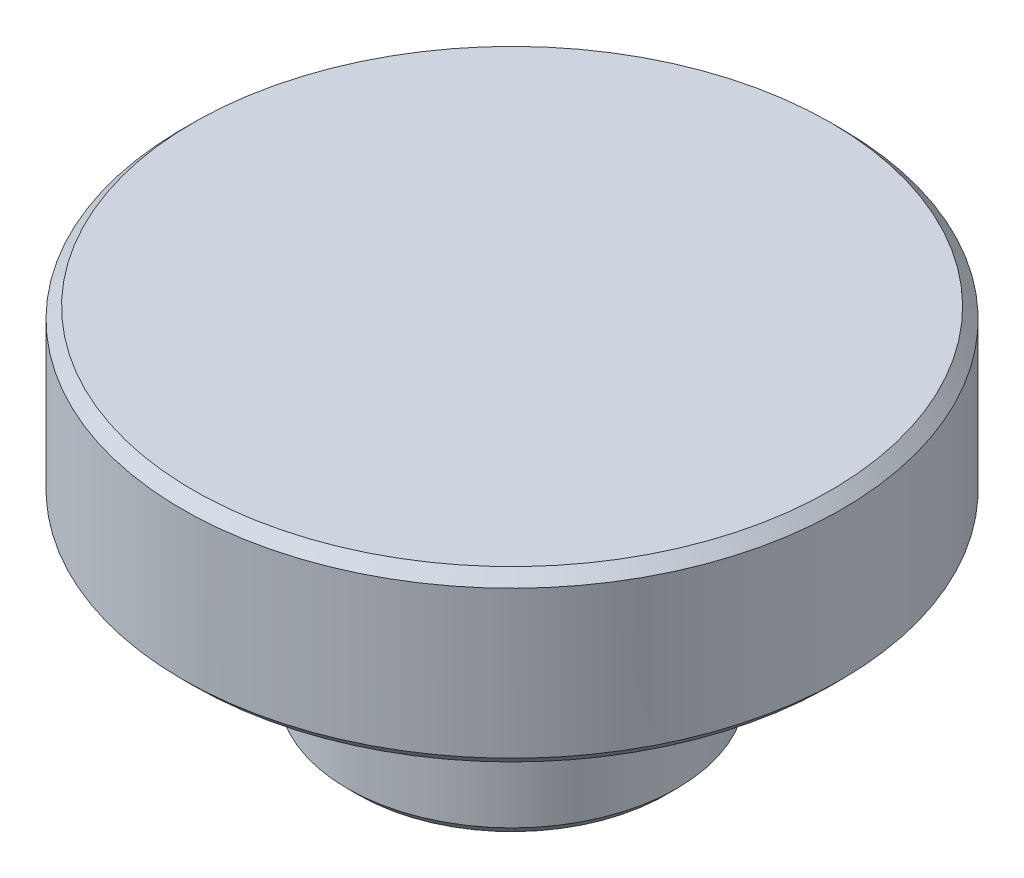
ISO-10303-21;
HEADER;
FILE_DESCRIPTION(('STEP AP214'),'2;1');
FILE_NAME('part.step','',(''),(''),'','','');
FILE_SCHEMA(('AUTOMOTIVE_DESIGN { 1 0 10303 214 1 1 1 1 }'));
ENDSEC;
DATA;
#1=APPLICATION_CONTEXT('core data for automotive mechanical design processes');
#2=APPLICATION_PROTOCOL_DEFINITION('international standard','automotive_design',2000,#1);
#3=PRODUCT_CONTEXT('',#1,'mechanical');
#4=PRODUCT('Part','Part','',(#3));
#5=PRODUCT_RELATED_PRODUCT_CATEGORY('part','',(#4));
#6=PRODUCT_DEFINITION_FORMATION('','',#4);
#7=PRODUCT_DEFINITION_CONTEXT('part definition',#1,'design');
#8=PRODUCT_DEFINITION('design','',#6,#7);
#9=PRODUCT_DEFINITION_SHAPE('','',#8);
#10=(LENGTH_UNIT() NAMED_UNIT(*) SI_UNIT(.MILLI.,.METRE.));
#11=(NAMED_UNIT(*) PLANE_ANGLE_UNIT() SI_UNIT($,.RADIAN.));
#12=(NAMED_UNIT(*) SI_UNIT($,.STERADIAN.) SOLID_ANGLE_UNIT());
#13=UNCERTAINTY_MEASURE_WITH_UNIT(LENGTH_MEASURE(1.E-05),#10,'distance_accuracy_value','');
#14=(GEOMETRIC_REPRESENTATION_CONTEXT(3) GLOBAL_UNCERTAINTY_ASSIGNED_CONTEXT((#13)) GLOBAL_UNIT_ASSIGNED_CONTEXT((#10,
#11,#12)) REPRESENTATION_CONTEXT('',''));
#15=CARTESIAN_POINT('',(0.,0.,0.));
#16=DIRECTION('',(0.,0.,1.));
#17=DIRECTION('',(1.,0.,0.));
#18=AXIS2_PLACEMENT_3D('',#15,#16,#17);
#19=CARTESIAN_POINT('',(0.,15.75,0.));
#20=DIRECTION('',(0.,-1.,0.));
#21=DIRECTION('',(0.,0.,-1.));
#22=AXIS2_PLACEMENT_3D('',#19,#20,#21);
#23=PLANE('',#22);
#24=CARTESIAN_POINT('',(0.,15.75,0.));
#25=DIRECTION('',(0.,-1.,0.));
#26=DIRECTION('',(0.,0.,-1.));
#27=AXIS2_PLACEMENT_3D('',#24,#25,#26);
#28=CIRCLE('',#27,14.5);
#29=CARTESIAN_POINT('',(0.,15.75,-14.5));
#30=VERTEX_POINT('',#29);
#31=EDGE_CURVE('E12',#30,#30,#28,.F.);
#32=ORIENTED_EDGE('',*,*,#31,.T.);
#33=EDGE_LOOP('',(#32));
#34=FACE_BOUND('',#33,.T.);
#35=ADVANCED_FACE('F42',(#34),#23,.F.);
#36=CARTESIAN_POINT('',(0.,0.,0.));
#37=DIRECTION('',(0.,-1.,0.));
#38=DIRECTION('',(0.,0.,-1.));
#39=AXIS2_PLACEMENT_3D('',#36,#37,#38);
#40=CYLINDRICAL_SURFACE('',#39,15.);
#41=CARTESIAN_POINT('',(0.,8.54999999999999,0.));
#42=DIRECTION('',(0.,1.,0.));
#43=DIRECTION('',(0.,0.,1.));
#44=AXIS2_PLACEMENT_3D('',#41,#42,#43);
#45=CIRCLE('',#44,15.);
#46=CARTESIAN_POINT('',(0.,8.54999999999999,15.));
#47=VERTEX_POINT('',#46);
#48=EDGE_CURVE('E54',#47,#47,#45,.T.);
#49=ORIENTED_EDGE('',*,*,#48,.T.);
#50=EDGE_LOOP('',(#49));
#51=FACE_BOUND('',#50,.T.);
#52=CARTESIAN_POINT('',(0.,15.25,0.));
#53=DIRECTION('',(0.,-1.,0.));
#54=DIRECTION('',(0.,0.,-1.));
#55=AXIS2_PLACEMENT_3D('',#52,#53,#54);
#56=CIRCLE('',#55,15.);
#57=CARTESIAN_POINT('',(0.,15.25,-15.));
#58=VERTEX_POINT('',#57);
#59=EDGE_CURVE('E58',#58,#58,#56,.T.);
#60=ORIENTED_EDGE('',*,*,#59,.T.);
#61=EDGE_LOOP('',(#60));
#62=FACE_BOUND('',#61,.T.);
#63=ADVANCED_FACE('F119',(#51,#62),#40,.T.);
#64=CARTESIAN_POINT('',(-15.,8.05,0.));
#65=DIRECTION('',(0.,1.,0.));
#66=DIRECTION('',(0.,0.,1.));
#67=AXIS2_PLACEMENT_3D('',#64,#65,#66);
#68=PLANE('',#67);
#69=CARTESIAN_POINT('',(0.,8.05,0.));
#70=DIRECTION('',(0.,1.,0.));
#71=DIRECTION('',(0.,0.,1.));
#72=AXIS2_PLACEMENT_3D('',#69,#70,#71);
#73=CIRCLE('',#72,7.99999999999999);
#74=CARTESIAN_POINT('',(0.,8.05,7.99999999999999));
#75=VERTEX_POINT('',#74);
#76=EDGE_CURVE('E63',#75,#75,#73,.T.);
#77=ORIENTED_EDGE('',*,*,#76,.T.);
#78=EDGE_LOOP('',(#77));
#79=FACE_BOUND('',#78,.T.);
#80=CARTESIAN_POINT('',(0.,8.05,0.));
#81=DIRECTION('',(0.,1.,0.));
#82=DIRECTION('',(0.,0.,1.));
#83=AXIS2_PLACEMENT_3D('',#80,#81,#82);
#84=CIRCLE('',#83,14.5);
#85=CARTESIAN_POINT('',(0.,8.05,14.5));
#86=VERTEX_POINT('',#85);
#87=EDGE_CURVE('E66',#86,#86,#84,.F.);
#88=ORIENTED_EDGE('',*,*,#87,.T.);
#89=EDGE_LOOP('',(#88));
#90=FACE_BOUND('',#89,.T.);
#91=ADVANCED_FACE('F115',(#79,#90),#68,.F.);
#92=CARTESIAN_POINT('',(0.,0.,0.));
#93=DIRECTION('',(0.,-1.,0.));
#94=DIRECTION('',(0.,0.,-1.));
#95=AXIS2_PLACEMENT_3D('',#92,#93,#94);
#96=CYLINDRICAL_SURFACE('',#95,7.5);
#97=CARTESIAN_POINT('',(0.,5.5,-7.5));
#98=CARTESIAN_POINT('',(-0.0559044178346422,5.49999764514654,-7.49999917871272));
#99=CARTESIAN_POINT('',(-0.11184298963814,5.49529623101876,-7.49936835363597));
#100=CARTESIAN_POINT('',(-0.22216136256904,5.47661682547522,-7.49691255563452));
#101=CARTESIAN_POINT('',(-0.276539511166519,5.46262935255143,-7.49508636220862));
#102=CARTESIAN_POINT('',(-0.382124156313492,5.42579914122928,-7.49044539924533));
#103=CARTESIAN_POINT('',(-0.433332841529247,5.40296259448078,-7.48763132105486));
#104=CARTESIAN_POINT('',(-0.53118194751515,5.34909654309686,-7.48132693330196));
#105=CARTESIAN_POINT('',(-0.577823103168513,5.31806835941677,-7.47783673279283));
#106=CARTESIAN_POINT('',(-0.665512911252339,5.24849336919791,-7.47054497394982));
#107=CARTESIAN_POINT('',(-0.706528992747932,5.20990567749577,-7.46674179081055));
#108=CARTESIAN_POINT('',(-0.781523678365509,5.12639490546167,-7.45926568778975));
#109=CARTESIAN_POINT('',(-0.815501909986106,5.0814714900021,-7.45559277481171));
#110=CARTESIAN_POINT('',(-0.875579511344538,4.98635043852748,-7.44877717720095));
#111=CARTESIAN_POINT('',(-0.90164803741289,4.93613315876069,-7.44563658882881));
#112=CARTESIAN_POINT('',(-0.944969225036452,4.83198446638161,-7.44026293689616));
#113=CARTESIAN_POINT('',(-0.96222226622639,4.77805321382334,-7.43802983425604));
#114=CARTESIAN_POINT('',(-0.98732303386087,4.66834709474917,-7.43473968284334));
#115=CARTESIAN_POINT('',(-0.995226021142533,4.61258508273354,-7.43367572685068));
#116=CARTESIAN_POINT('',(-1.00157340274059,4.50051691019702,-7.43282325804657));
#117=CARTESIAN_POINT('',(-1.00001822816801,4.44421077459455,-7.433034687102));
#118=CARTESIAN_POINT('',(-0.987538729696173,4.33303943498603,-7.43470277886495));
#119=CARTESIAN_POINT('',(-0.976675487658809,4.27816723505715,-7.43615132311171));
#120=CARTESIAN_POINT('',(-0.945983623171858,4.17103158161996,-7.44011776387373));
#121=CARTESIAN_POINT('',(-0.926154796307287,4.11876818762249,-7.44263568477064));
#122=CARTESIAN_POINT('',(-0.878029645715956,4.0181451826464,-7.44846630555513));
#123=CARTESIAN_POINT('',(-0.849706989568747,3.96979831440285,-7.45178147061949));
#124=CARTESIAN_POINT('',(-0.785416966721447,3.87852045904117,-7.45883118109967));
#125=CARTESIAN_POINT('',(-0.749449202511926,3.83558975372292,-7.46256574831765));
#126=CARTESIAN_POINT('',(-0.670552450131813,3.75600849370905,-7.47006949616793));
#127=CARTESIAN_POINT('',(-0.627570853513224,3.71941007864884,-7.47383871770599));
#128=CARTESIAN_POINT('',(-0.536047085066705,3.6539389775358,-7.48095961909132));
#129=CARTESIAN_POINT('',(-0.487504897221186,3.62506631373824,-7.48431129773577));
#130=CARTESIAN_POINT('',(-0.386196109865235,3.57586544115263,-7.4902219687179));
#131=CARTESIAN_POINT('',(-0.333427789420616,3.55554073447684,-7.49278063604478));
#132=CARTESIAN_POINT('',(-0.225185462168125,3.52405534051383,-7.49681412952036));
#133=CARTESIAN_POINT('',(-0.169711599771129,3.5128941646803,-7.49828901344964));
#134=CARTESIAN_POINT('',(-0.0580834516628217,3.50012078361444,-7.49998120688428));
#135=CARTESIAN_POINT('',(-0.00193751727352099,3.49843679910826,-7.50020796924523));
#136=CARTESIAN_POINT('',(0.109835808609359,3.50447583206359,-7.49940395769259));
#137=CARTESIAN_POINT('',(0.165463212672832,3.51219862089118,-7.49837321434299));
#138=CARTESIAN_POINT('',(0.274406857786469,3.53677232669199,-7.4951758767905));
#139=CARTESIAN_POINT('',(0.327731008256023,3.55358878416107,-7.49301357151461));
#140=CARTESIAN_POINT('',(0.43080254939678,3.59583648296854,-7.48779504627144));
#141=CARTESIAN_POINT('',(0.480549803507819,3.62126805300662,-7.4847387921972));
#142=CARTESIAN_POINT('',(0.57537443930804,3.68019607779165,-7.47804918685037));
#143=CARTESIAN_POINT('',(0.620422907198302,3.71373868285667,-7.47441257522858));
#144=CARTESIAN_POINT('',(0.704276473495949,3.78787166461213,-7.46697864354991));
#145=CARTESIAN_POINT('',(0.743081288311893,3.82846236125822,-7.4631813162031));
#146=CARTESIAN_POINT('',(0.813602747115491,3.91585657131977,-7.45582451236755));
#147=CARTESIAN_POINT('',(0.845271638044692,3.96269878336908,-7.45226674387649));
#148=CARTESIAN_POINT('',(0.90029175539407,4.06107970514046,-7.44582066500908));
#149=CARTESIAN_POINT('',(0.923643167551733,4.11261830995519,-7.44293233968392));
#150=CARTESIAN_POINT('',(0.961289182503731,4.21877862101385,-7.43816405890039));
#151=CARTESIAN_POINT('',(0.975610144233978,4.2733908426054,-7.43628117116299));
#152=CARTESIAN_POINT('',(0.994873335719795,4.38427181606438,-7.43372874349146));
#153=CARTESIAN_POINT('',(0.999816067133909,4.44054047916222,-7.43305913865671));
#154=CARTESIAN_POINT('',(1.00017242903095,4.55266174542675,-7.43301115647724));
#155=CARTESIAN_POINT('',(0.995661095972464,4.60851412048212,-7.4336226114126));
#156=CARTESIAN_POINT('',(0.977396883433446,4.71865893755194,-7.43604591937099));
#157=CARTESIAN_POINT('',(0.963644007416343,4.77295138015099,-7.43785777194415));
#158=CARTESIAN_POINT('',(0.927311551661037,4.87842184162579,-7.44247445136382));
#159=CARTESIAN_POINT('',(0.904736104095206,4.92960130555843,-7.445278813297));
#160=CARTESIAN_POINT('',(0.851406713798687,5.02745794191303,-7.45156522856411));
#161=CARTESIAN_POINT('',(0.820652613152143,5.07413502737802,-7.45504729498301));
#162=CARTESIAN_POINT('',(0.751562242547542,5.1620448249642,-7.46232983591531));
#163=CARTESIAN_POINT('',(0.713170136134505,5.20323347387756,-7.46613252877041));
#164=CARTESIAN_POINT('',(0.630010846749118,5.27861160818077,-7.47360859500832));
#165=CARTESIAN_POINT('',(0.585242170364888,5.31279944937512,-7.47728193784489));
#166=CARTESIAN_POINT('',(0.490376493926411,5.37333356923326,-7.48410317568764));
#167=CARTESIAN_POINT('',(0.440257310371983,5.39964533327762,-7.48724873213445));
#168=CARTESIAN_POINT('',(0.336296204793664,5.44344029927254,-7.49263660329486));
#169=CARTESIAN_POINT('',(0.282458339484944,5.46093295431243,-7.49487988462156));
#170=CARTESIAN_POINT('',(0.190294204049209,5.48247400319259,-7.49767860871633));
#171=CARTESIAN_POINT('',(0.152545540977889,5.48903662176182,-7.49854481817537));
#172=CARTESIAN_POINT('',(0.0765365858080555,5.49780040708274,-7.49970579245385));
#173=CARTESIAN_POINT('',(0.03827629822562,5.5000016123068,-7.500000562314));
#174=CARTESIAN_POINT('',(0.,5.5,-7.5));
#175=B_SPLINE_CURVE_WITH_KNOTS('',3,(#97,#98,#99,#100,#101,#102,#103,#104,#105,#106,#107,#108,
#109,#110,#111,#112,#113,#114,#115,#116,#117,#118,#119,#120,#121,#122,#123,#124,#125,#126,#127,
#128,#129,#130,#131,#132,#133,#134,#135,#136,#137,#138,#139,#140,#141,#142,#143,#144,#145,#146,
#147,#148,#149,#150,#151,#152,#153,#154,#155,#156,#157,#158,#159,#160,#161,#162,#163,#164,#165,
#166,#167,#168,#169,#170,#171,#172,#173,#174),.UNSPECIFIED.,.T.,.F.,(4,2,2,2,2,2,2,2,2,2,2,2,2,
2,2,2,2,2,2,2,2,2,2,2,2,2,2,2,2,2,2,2,2,2,2,2,2,2,4),(0.,0.167573425652872,0.335318215442522,
0.502945846413703,0.670546462820173,0.839079892217795,1.00762223952418,1.17681360755824,
1.34599768883102,1.5141767795718,1.6823482046246,1.84942442549022,2.01650445587925,
2.18410791568949,2.35172009221899,2.52065272242425,2.68958583926148,2.85858810101269,
3.02758135195872,3.19529292496031,3.36300042177239,3.53007681698232,3.69715958751773,
3.86521637384942,4.03328079129381,4.20243852267725,4.37159247636524,4.54025037367727,
4.70889924891818,4.87621463748313,5.04352996334373,5.21076701851311,5.37800730297952,
5.54651833917554,5.71506890625581,5.88434763337258,6.0534445249621,6.16817869523655,
6.2829118534272),.UNSPECIFIED.);
#176=CARTESIAN_POINT('',(0.,5.5,-7.5));
#177=VERTEX_POINT('',#176);
#178=EDGE_CURVE('E84',#177,#177,#175,.T.);
#179=ORIENTED_EDGE('',*,*,#178,.T.);
#180=EDGE_LOOP('',(#179));
#181=FACE_BOUND('',#180,.T.);
#182=CARTESIAN_POINT('',(0.,0.500000000000007,0.));
#183=DIRECTION('',(0.,1.,0.));
#184=DIRECTION('',(0.,0.,1.));
#185=AXIS2_PLACEMENT_3D('',#182,#183,#184);
#186=CIRCLE('',#185,7.5);
#187=CARTESIAN_POINT('',(0.,0.500000000000007,7.5));
#188=VERTEX_POINT('',#187);
#189=EDGE_CURVE('E69',#188,#188,#186,.T.);
#190=ORIENTED_EDGE('',*,*,#189,.T.);
#191=EDGE_LOOP('',(#190));
#192=FACE_BOUND('',#191,.T.);
#193=CARTESIAN_POINT('',(0.,7.55000000000001,0.));
#194=DIRECTION('',(0.,1.,0.));
#195=DIRECTION('',(0.,0.,1.));
#196=AXIS2_PLACEMENT_3D('',#193,#194,#195);
#197=CIRCLE('',#196,7.5);
#198=CARTESIAN_POINT('',(0.,7.55000000000001,7.5));
#199=VERTEX_POINT('',#198);
#200=EDGE_CURVE('E72',#199,#199,#197,.F.);
#201=ORIENTED_EDGE('',*,*,#200,.T.);
#202=EDGE_LOOP('',(#201));
#203=FACE_BOUND('',#202,.T.);
#204=ADVANCED_FACE('F89',(#181,#192,#203),#96,.T.);
#205=CARTESIAN_POINT('',(-7.5,0.,0.));
#206=DIRECTION('',(0.,1.,0.));
#207=DIRECTION('',(0.,0.,1.));
#208=AXIS2_PLACEMENT_3D('',#205,#206,#207);
#209=PLANE('',#208);
#210=CARTESIAN_POINT('',(0.,0.,0.));
#211=DIRECTION('',(0.,1.,0.));
#212=DIRECTION('',(0.,0.,1.));
#213=AXIS2_PLACEMENT_3D('',#210,#211,#212);
#214=CIRCLE('',#213,7.);
#215=CARTESIAN_POINT('',(0.,0.,7.));
#216=VERTEX_POINT('',#215);
#217=EDGE_CURVE('E75',#216,#216,#214,.F.);
#218=ORIENTED_EDGE('',*,*,#217,.T.);
#219=EDGE_LOOP('',(#218));
#220=FACE_BOUND('',#219,.T.);
#221=CARTESIAN_POINT('',(0.,0.,0.));
#222=DIRECTION('',(0.,-1.,0.));
#223=DIRECTION('',(0.,0.,-1.));
#224=AXIS2_PLACEMENT_3D('',#221,#222,#223);
#225=CIRCLE('',#224,2.5);
#226=CARTESIAN_POINT('',(0.,0.,-2.5));
#227=VERTEX_POINT('',#226);
#228=EDGE_CURVE('E78',#227,#227,#225,.T.);
#229=ORIENTED_EDGE('',*,*,#228,.F.);
#230=EDGE_LOOP('',(#229));
#231=FACE_BOUND('',#230,.T.);
#232=ADVANCED_FACE('F106',(#220,#231),#209,.F.);
#233=CARTESIAN_POINT('',(0.,0.,0.));
#234=DIRECTION('',(0.,-1.,0.));
#235=DIRECTION('',(0.,0.,-1.));
#236=AXIS2_PLACEMENT_3D('',#233,#234,#235);
#237=CYLINDRICAL_SURFACE('',#236,2.5);
#238=CARTESIAN_POINT('',(0.,5.5,-2.5));
#239=CARTESIAN_POINT('',(0.0537465027214457,5.49999507408814,-2.49999635613542));
#240=CARTESIAN_POINT('',(0.107586282045337,5.49564112395581,-2.49824647153466));
#241=CARTESIAN_POINT('',(0.213748240208948,5.47837614823938,-2.49141726550321));
#242=CARTESIAN_POINT('',(0.266065888780624,5.46544186045693,-2.48632889349439));
#243=CARTESIAN_POINT('',(0.367476961363702,5.43156196097059,-2.47337104606559));
#244=CARTESIAN_POINT('',(0.416580330808479,5.41064257689164,-2.46551068182036));
#245=CARTESIAN_POINT('',(0.510535985164184,5.36149041333673,-2.44778305398039));
#246=CARTESIAN_POINT('',(0.555389738375496,5.33326017254053,-2.43791648729028));
#247=CARTESIAN_POINT('',(0.641750503785197,5.26888225071953,-2.41665443085209));
#248=CARTESIAN_POINT('',(0.683031136275107,5.23244667187987,-2.40521148464595));
#249=CARTESIAN_POINT('',(0.759087502392361,5.15329999826161,-2.38230288453097));
#250=CARTESIAN_POINT('',(0.793860053566767,5.11058585139413,-2.37083722226896));
#251=CARTESIAN_POINT('',(0.85743728364644,5.01778596487887,-2.34861395898568));
#252=CARTESIAN_POINT('',(0.885907490597737,4.9674567569884,-2.33791057982476));
#253=CARTESIAN_POINT('',(0.933877359518575,4.86223180078998,-2.31916823593396));
#254=CARTESIAN_POINT('',(0.953381282142918,4.80733823607582,-2.31112800622088));
#255=CARTESIAN_POINT('',(0.981949411697934,4.69714383320395,-2.29913178830409));
#256=CARTESIAN_POINT('',(0.991446982902824,4.64197438221189,-2.29500710177802));
#257=CARTESIAN_POINT('',(1.00108648082002,4.53068250084637,-2.29082002024572));
#258=CARTESIAN_POINT('',(1.00123300815661,4.47456055268749,-2.29075562761384));
#259=CARTESIAN_POINT('',(0.992494683752273,4.36712166427098,-2.29455250139997));
#260=CARTESIAN_POINT('',(0.984237657152569,4.31574214279548,-2.29814087519225));
#261=CARTESIAN_POINT('',(0.959973440148911,4.21517022199664,-2.30838093803918));
#262=CARTESIAN_POINT('',(0.943964897402316,4.16597820594485,-2.31503316160836));
#263=CARTESIAN_POINT('',(0.904347366275537,4.06999108190198,-2.33079742544265));
#264=CARTESIAN_POINT('',(0.880589931157659,4.02326538047265,-2.33995689640394));
#265=CARTESIAN_POINT('',(0.826253230366107,3.93429209181922,-2.35969058194945));
#266=CARTESIAN_POINT('',(0.795671402550422,3.8920461952986,-2.37026532728424));
#267=CARTESIAN_POINT('',(0.725775299727218,3.809795135599,-2.39263368371135));
#268=CARTESIAN_POINT('',(0.685968731485318,3.77021563527699,-2.40445832488076));
#269=CARTESIAN_POINT('',(0.600157213715097,3.69815776099898,-2.42729912479141));
#270=CARTESIAN_POINT('',(0.554151032667217,3.66568080129485,-2.43831512222662));
#271=CARTESIAN_POINT('',(0.456038826302922,3.60819127629208,-2.45857340632274));
#272=CARTESIAN_POINT('',(0.403830245673239,3.58333885940147,-2.46777635047707));
#273=CARTESIAN_POINT('',(0.295511882741441,3.54291606946097,-2.48307414164379));
#274=CARTESIAN_POINT('',(0.239404098424837,3.52734098122129,-2.48917056731191));
#275=CARTESIAN_POINT('',(0.12844794380391,3.50677585229015,-2.49728069753455));
#276=CARTESIAN_POINT('',(0.0737216469927676,3.50121377287322,-2.49951472916757));
#277=CARTESIAN_POINT('',(-0.0359226549039085,3.49914344973569,-2.50034239255315));
#278=CARTESIAN_POINT('',(-0.0908406066119618,3.50263285922624,-2.49893696791146));
#279=CARTESIAN_POINT('',(-0.196716369560994,3.51814587627599,-2.49278783531877));
#280=CARTESIAN_POINT('',(-0.247741245887737,3.52977899017549,-2.48819695672762));
#281=CARTESIAN_POINT('',(-0.34706771403039,3.56071785415491,-2.4762972070275));
#282=CARTESIAN_POINT('',(-0.395368955112422,3.58002458983434,-2.46898798678265));
#283=CARTESIAN_POINT('',(-0.489539392908351,3.62639246983997,-2.45208297385406));
#284=CARTESIAN_POINT('',(-0.535289011377703,3.65367273602157,-2.44242407989902));
#285=CARTESIAN_POINT('',(-0.621721795623278,3.71497016195282,-2.42186682372762));
#286=CARTESIAN_POINT('',(-0.662402920380563,3.74899002146131,-2.41096796555135));
#287=CARTESIAN_POINT('',(-0.74036152151441,3.82543500647481,-2.38822558819056));
#288=CARTESIAN_POINT('',(-0.777236966903033,3.8682667707531,-2.37636720712526));
#289=CARTESIAN_POINT('',(-0.843375598706856,3.95972004150468,-2.35370836458566));
#290=CARTESIAN_POINT('',(-0.872637530668755,4.00834250016997,-2.34290807763255));
#291=CARTESIAN_POINT('',(-0.922903750965814,4.11073084729705,-2.32357149953854));
#292=CARTESIAN_POINT('',(-0.943825297267228,4.16454199960616,-2.31505815442394));
#293=CARTESIAN_POINT('',(-0.976148109852653,4.27536682585758,-2.30161836738966));
#294=CARTESIAN_POINT('',(-0.987556402634659,4.33237810290621,-2.29668927847999));
#295=CARTESIAN_POINT('',(-0.999857808639202,4.44356395088727,-2.29135879649963));
#296=CARTESIAN_POINT('',(-1.00144854115143,4.49764741979668,-2.29065710504086));
#297=CARTESIAN_POINT('',(-0.995901579638763,4.60527242885665,-2.29307418016549));
#298=CARTESIAN_POINT('',(-0.988764993956892,4.65881403695129,-2.29619246162397));
#299=CARTESIAN_POINT('',(-0.966535683076825,4.76166609492752,-2.3056332453951));
#300=CARTESIAN_POINT('',(-0.95176874678549,4.8110601372165,-2.31182415913725));
#301=CARTESIAN_POINT('',(-0.915002724245507,4.90668931480674,-2.32662000616348));
#302=CARTESIAN_POINT('',(-0.893001640696907,4.95292357344991,-2.33522560603003));
#303=CARTESIAN_POINT('',(-0.840936381379866,5.04380480963539,-2.35449304802246));
#304=CARTESIAN_POINT('',(-0.810482667579745,5.08820933506524,-2.36524441156621));
#305=CARTESIAN_POINT('',(-0.742946059635748,5.17149665860188,-2.38731902186119));
#306=CARTESIAN_POINT('',(-0.705861167409061,5.21037778606416,-2.39864244024203));
#307=CARTESIAN_POINT('',(-0.623252753136232,5.28410142663181,-2.42146783543697));
#308=CARTESIAN_POINT('',(-0.577338000573069,5.31851865344903,-2.43293378981093));
#309=CARTESIAN_POINT('',(-0.47995016014289,5.37916852131082,-2.45400203356858));
#310=CARTESIAN_POINT('',(-0.428474502273619,5.40539735607627,-2.46360345546453));
#311=CARTESIAN_POINT('',(-0.322369031247602,5.44831110759515,-2.47969857407931));
#312=CARTESIAN_POINT('',(-0.267815809109848,5.46516466178017,-2.48624681527514));
#313=CARTESIAN_POINT('',(-0.156438273140611,5.48931956047713,-2.49572153104683));
#314=CARTESIAN_POINT('',(-0.0996217629294565,5.49665121837195,-2.49865949747819));
#315=CARTESIAN_POINT('',(-0.0284561489454649,5.49969769048914,-2.49987949752068));
#316=CARTESIAN_POINT('',(-0.0142313443703792,5.5000013043146,-2.50000096484588));
#317=CARTESIAN_POINT('',(0.,5.5,-2.5));
#318=B_SPLINE_CURVE_WITH_KNOTS('',3,(#238,#239,#240,#241,#242,#243,#244,#245,#246,#247,#248,
#249,#250,#251,#252,#253,#254,#255,#256,#257,#258,#259,#260,#261,#262,#263,#264,#265,#266,#267,
#268,#269,#270,#271,#272,#273,#274,#275,#276,#277,#278,#279,#280,#281,#282,#283,#284,#285,#286,
#287,#288,#289,#290,#291,#292,#293,#294,#295,#296,#297,#298,#299,#300,#301,#302,#303,#304,#305,
#306,#307,#308,#309,#310,#311,#312,#313,#314,#315,#316,#317),.UNSPECIFIED.,.T.,.F.,(4,2,2,2,2,2,
2,2,2,2,2,2,2,2,2,2,2,2,2,2,2,2,2,2,2,2,2,2,2,2,2,2,2,2,2,2,2,2,2,4),(0.,0.161201493946536,
0.322841818003967,0.48395572873579,0.645013767839921,0.812986908501986,0.981041974672057,
1.15657629409608,1.33202711559134,1.49952052654414,1.66693153170244,1.82269164200686,
1.97847893628024,2.13744563149408,2.29647210969092,2.46779174593279,2.63914546419867,
2.81388456581403,2.98853478056895,3.15284592264004,3.31711446785041,3.47400227782183,
3.63091024496898,3.79261756699132,3.95438979749485,4.12684237312207,4.29932334521874,
4.47347522570414,4.64749836322967,4.80899836696374,4.97047786281523,5.12557159274385,
5.28070817902581,5.44472734028347,5.60879600674197,5.78350211766918,5.95828931820267,
6.1298215050666,6.30080626202172,6.34349022948398),.UNSPECIFIED.);
#319=CARTESIAN_POINT('',(0.,5.5,-2.5));
#320=VERTEX_POINT('',#319);
#321=EDGE_CURVE('E46',#320,#320,#318,.T.);
#322=ORIENTED_EDGE('',*,*,#321,.T.);
#323=EDGE_LOOP('',(#322));
#324=FACE_BOUND('',#323,.T.);
#325=CARTESIAN_POINT('',(0.,10.,0.));
#326=DIRECTION('',(0.,-1.,0.));
#327=DIRECTION('',(0.,0.,-1.));
#328=AXIS2_PLACEMENT_3D('',#325,#326,#327);
#329=CIRCLE('',#328,2.5);
#330=CARTESIAN_POINT('',(0.,10.,-2.5));
#331=VERTEX_POINT('',#330);
#332=EDGE_CURVE('E81',#331,#331,#329,.T.);
#333=ORIENTED_EDGE('',*,*,#332,.F.);
#334=EDGE_LOOP('',(#333));
#335=FACE_BOUND('',#334,.T.);
#336=ORIENTED_EDGE('',*,*,#228,.T.);
#337=EDGE_LOOP('',(#336));
#338=FACE_BOUND('',#337,.T.);
#339=ADVANCED_FACE('F102',(#324,#335,#338),#237,.F.);
#340=CARTESIAN_POINT('',(-2.5,10.,0.));
#341=DIRECTION('',(0.,1.,0.));
#342=DIRECTION('',(0.,0.,1.));
#343=AXIS2_PLACEMENT_3D('',#340,#341,#342);
#344=PLANE('',#343);
#345=ORIENTED_EDGE('',*,*,#332,.T.);
#346=EDGE_LOOP('',(#345));
#347=FACE_BOUND('',#346,.T.);
#348=ADVANCED_FACE('F98',(#347),#344,.F.);
#349=CARTESIAN_POINT('',(0.,0.,0.));
#350=DIRECTION('',(0.,1.,0.));
#351=DIRECTION('',(0.,0.,1.));
#352=AXIS2_PLACEMENT_3D('',#349,#350,#351);
#353=CONICAL_SURFACE('',#352,7.,0.785398163397442);
#354=ORIENTED_EDGE('',*,*,#189,.F.);
#355=EDGE_LOOP('',(#354));
#356=FACE_BOUND('',#355,.T.);
#357=ORIENTED_EDGE('',*,*,#217,.F.);
#358=EDGE_LOOP('',(#357));
#359=FACE_BOUND('',#358,.T.);
#360=ADVANCED_FACE('F101',(#356,#359),#353,.T.);
#361=CARTESIAN_POINT('',(0.,7.55000000000001,0.));
#362=DIRECTION('',(0.,1.,0.));
#363=DIRECTION('',(0.,0.,1.));
#364=AXIS2_PLACEMENT_3D('',#361,#362,#363);
#365=CONICAL_SURFACE('',#364,7.5,0.78539816339745);
#366=ORIENTED_EDGE('',*,*,#76,.F.);
#367=EDGE_LOOP('',(#366));
#368=FACE_BOUND('',#367,.T.);
#369=ORIENTED_EDGE('',*,*,#200,.F.);
#370=EDGE_LOOP('',(#369));
#371=FACE_BOUND('',#370,.T.);
#372=ADVANCED_FACE('F129',(#368,#371),#365,.T.);
#373=CARTESIAN_POINT('',(0.,8.05,0.));
#374=DIRECTION('',(0.,1.,0.));
#375=DIRECTION('',(0.,0.,1.));
#376=AXIS2_PLACEMENT_3D('',#373,#374,#375);
#377=CONICAL_SURFACE('',#376,14.5,0.78539816339745);
#378=ORIENTED_EDGE('',*,*,#48,.F.);
#379=EDGE_LOOP('',(#378));
#380=FACE_BOUND('',#379,.T.);
#381=ORIENTED_EDGE('',*,*,#87,.F.);
#382=EDGE_LOOP('',(#381));
#383=FACE_BOUND('',#382,.T.);
#384=ADVANCED_FACE('F132',(#380,#383),#377,.T.);
#385=CARTESIAN_POINT('',(0.,15.25,0.));
#386=DIRECTION('',(0.,-1.,0.));
#387=DIRECTION('',(0.,0.,-1.));
#388=AXIS2_PLACEMENT_3D('',#385,#386,#387);
#389=CONICAL_SURFACE('',#388,15.,0.785398163397452);
#390=ORIENTED_EDGE('',*,*,#31,.F.);
#391=EDGE_LOOP('',(#390));
#392=FACE_BOUND('',#391,.T.);
#393=ORIENTED_EDGE('',*,*,#59,.F.);
#394=EDGE_LOOP('',(#393));
#395=FACE_BOUND('',#394,.T.);
#396=ADVANCED_FACE('F44',(#392,#395),#389,.T.);
#397=CARTESIAN_POINT('',(0.,4.5,-15.));
#398=DIRECTION('',(0.,0.,1.));
#399=DIRECTION('',(1.,0.,0.));
#400=AXIS2_PLACEMENT_3D('',#397,#398,#399);
#401=CYLINDRICAL_SURFACE('',#400,1.);
#402=ORIENTED_EDGE('',*,*,#321,.F.);
#403=EDGE_LOOP('',(#402));
#404=FACE_BOUND('',#403,.T.);
#405=ORIENTED_EDGE('',*,*,#178,.F.);
#406=EDGE_LOOP('',(#405));
#407=FACE_BOUND('',#406,.T.);
#408=ADVANCED_FACE('F93',(#404,#407),#401,.F.);
#409=CLOSED_SHELL('',(#35,#63,#91,#204,#232,#339,#348,#360,#372,#384,#396,#408));
#410=MANIFOLD_SOLID_BREP('B2',#409);
#411=ADVANCED_BREP_SHAPE_REPRESENTATION('',(#18,#410),#14);
#412=SHAPE_DEFINITION_REPRESENTATION(#9,#411);
ENDSEC;
END-ISO-10303-21;
